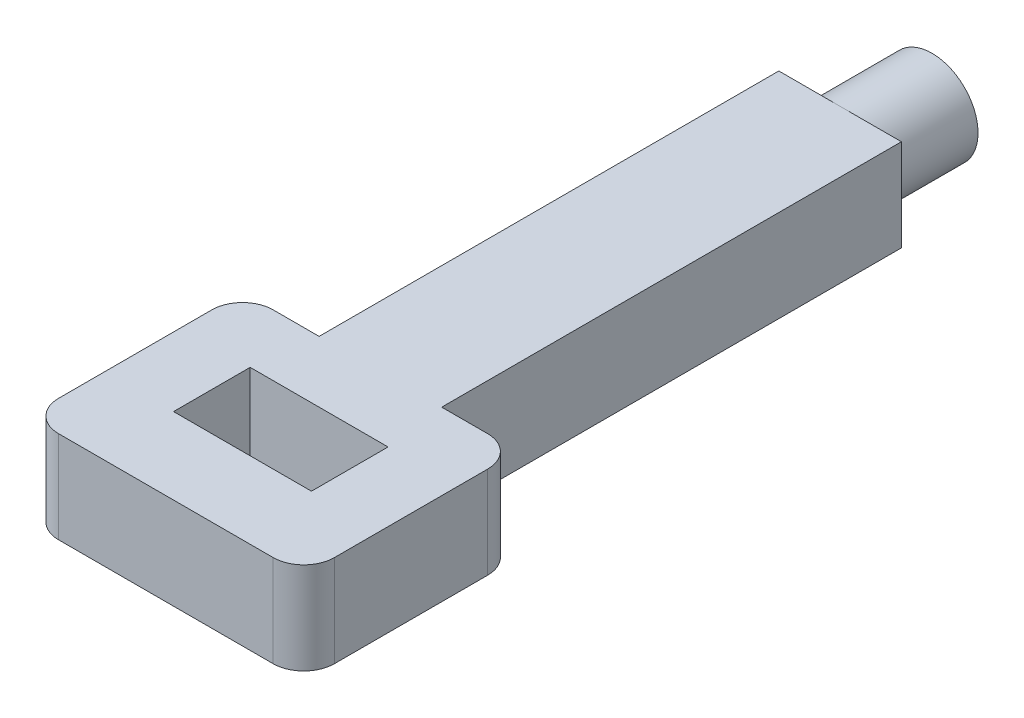
ISO-10303-21;
HEADER;
FILE_DESCRIPTION(('STEP AP214'),'2;1');
FILE_NAME('part.step','',(''),(''),'','','');
FILE_SCHEMA(('AUTOMOTIVE_DESIGN { 1 0 10303 214 1 1 1 1 }'));
ENDSEC;
DATA;
#1=APPLICATION_CONTEXT('core data for automotive mechanical design processes');
#2=APPLICATION_PROTOCOL_DEFINITION('international standard','automotive_design',2000,#1);
#3=PRODUCT_CONTEXT('',#1,'mechanical');
#4=PRODUCT('Part','Part','',(#3));
#5=PRODUCT_RELATED_PRODUCT_CATEGORY('part','',(#4));
#6=PRODUCT_DEFINITION_FORMATION('','',#4);
#7=PRODUCT_DEFINITION_CONTEXT('part definition',#1,'design');
#8=PRODUCT_DEFINITION('design','',#6,#7);
#9=PRODUCT_DEFINITION_SHAPE('','',#8);
#10=(LENGTH_UNIT() NAMED_UNIT(*) SI_UNIT(.MILLI.,.METRE.));
#11=(NAMED_UNIT(*) PLANE_ANGLE_UNIT() SI_UNIT($,.RADIAN.));
#12=(NAMED_UNIT(*) SI_UNIT($,.STERADIAN.) SOLID_ANGLE_UNIT());
#13=UNCERTAINTY_MEASURE_WITH_UNIT(LENGTH_MEASURE(1.E-05),#10,'distance_accuracy_value','');
#14=(GEOMETRIC_REPRESENTATION_CONTEXT(3) GLOBAL_UNCERTAINTY_ASSIGNED_CONTEXT((#13)) GLOBAL_UNIT_ASSIGNED_CONTEXT((#10,
#11,#12)) REPRESENTATION_CONTEXT('',''));
#15=CARTESIAN_POINT('',(0.,0.,0.));
#16=DIRECTION('',(0.,0.,1.));
#17=DIRECTION('',(1.,0.,0.));
#18=AXIS2_PLACEMENT_3D('',#15,#16,#17);
#19=CARTESIAN_POINT('',(-2.,3.,-22.));
#20=DIRECTION('',(0.,0.,1.));
#21=DIRECTION('',(1.,0.,0.));
#22=AXIS2_PLACEMENT_3D('',#19,#20,#21);
#23=PLANE('',#22);
#24=CARTESIAN_POINT('',(0.,1.49999999999648,-22.));
#25=DIRECTION('',(0.,0.,-1.));
#26=DIRECTION('',(-1.,0.,0.));
#27=AXIS2_PLACEMENT_3D('',#24,#25,#26);
#28=CIRCLE('',#27,1.5);
#29=CARTESIAN_POINT('',(0.,2.99999999999648,-22.));
#30=VERTEX_POINT('',#29);
#31=CARTESIAN_POINT('',(0.,0.,-22.));
#32=VERTEX_POINT('',#31);
#33=EDGE_CURVE('E42',#30,#32,#28,.T.);
#34=ORIENTED_EDGE('',*,*,#33,.F.);
#35=DIRECTION('',(-1.,0.,0.));
#36=VECTOR('',#35,1.);
#37=CARTESIAN_POINT('',(-2.,3.,-22.));
#38=LINE('',#37,#36);
#39=CARTESIAN_POINT('',(2.,3.,-22.));
#40=VERTEX_POINT('',#39);
#41=EDGE_CURVE('E153',#40,#30,#38,.T.);
#42=ORIENTED_EDGE('',*,*,#41,.F.);
#43=DIRECTION('',(0.,-1.,0.));
#44=VECTOR('',#43,1.);
#45=CARTESIAN_POINT('',(2.,3.,-22.));
#46=LINE('',#45,#44);
#47=CARTESIAN_POINT('',(2.,0.,-22.));
#48=VERTEX_POINT('',#47);
#49=EDGE_CURVE('E310',#40,#48,#46,.T.);
#50=ORIENTED_EDGE('',*,*,#49,.T.);
#51=DIRECTION('',(-1.,0.,0.));
#52=VECTOR('',#51,1.);
#53=CARTESIAN_POINT('',(-2.,0.,-22.));
#54=LINE('',#53,#52);
#55=EDGE_CURVE('E174',#48,#32,#54,.T.);
#56=ORIENTED_EDGE('',*,*,#55,.T.);
#57=EDGE_LOOP('',(#34,#42,#50,#56));
#58=FACE_BOUND('',#57,.T.);
#59=ADVANCED_FACE('F32',(#58),#23,.F.);
#60=CARTESIAN_POINT('',(0.,3.,0.));
#61=DIRECTION('',(0.,-1.,0.));
#62=DIRECTION('',(0.,0.,-1.));
#63=AXIS2_PLACEMENT_3D('',#60,#61,#62);
#64=PLANE('',#63);
#65=DIRECTION('',(0.,0.,-1.));
#66=VECTOR('',#65,1.);
#67=CARTESIAN_POINT('',(4.5,3.,0.));
#68=LINE('',#67,#66);
#69=CARTESIAN_POINT('',(4.5,3.,-1.));
#70=VERTEX_POINT('',#69);
#71=CARTESIAN_POINT('',(4.5,3.,-6.));
#72=VERTEX_POINT('',#71);
#73=EDGE_CURVE('E275',#70,#72,#68,.T.);
#74=ORIENTED_EDGE('',*,*,#73,.T.);
#75=CARTESIAN_POINT('',(3.5,3.,-6.));
#76=DIRECTION('',(0.,-1.,0.));
#77=DIRECTION('',(0.,0.,-1.));
#78=AXIS2_PLACEMENT_3D('',#75,#76,#77);
#79=CIRCLE('',#78,1.);
#80=CARTESIAN_POINT('',(3.5,3.,-7.));
#81=VERTEX_POINT('',#80);
#82=EDGE_CURVE('E253',#72,#81,#79,.F.);
#83=ORIENTED_EDGE('',*,*,#82,.T.);
#84=DIRECTION('',(-1.,0.,0.));
#85=VECTOR('',#84,1.);
#86=CARTESIAN_POINT('',(4.5,3.,-7.));
#87=LINE('',#86,#85);
#88=CARTESIAN_POINT('',(2.,3.,-7.));
#89=VERTEX_POINT('',#88);
#90=EDGE_CURVE('E278',#81,#89,#87,.T.);
#91=ORIENTED_EDGE('',*,*,#90,.T.);
#92=DIRECTION('',(0.,0.,-1.));
#93=VECTOR('',#92,1.);
#94=CARTESIAN_POINT('',(2.,3.,-7.));
#95=LINE('',#94,#93);
#96=EDGE_CURVE('E160',#89,#40,#95,.T.);
#97=ORIENTED_EDGE('',*,*,#96,.T.);
#98=ORIENTED_EDGE('',*,*,#41,.T.);
#99=CARTESIAN_POINT('',(-2.,3.,-22.));
#100=VERTEX_POINT('',#99);
#101=EDGE_CURVE('E157',#30,#100,#38,.T.);
#102=ORIENTED_EDGE('',*,*,#101,.T.);
#103=DIRECTION('',(0.,0.,1.));
#104=VECTOR('',#103,1.);
#105=CARTESIAN_POINT('',(-2.,3.,-7.));
#106=LINE('',#105,#104);
#107=CARTESIAN_POINT('',(-2.,3.,-7.));
#108=VERTEX_POINT('',#107);
#109=EDGE_CURVE('E165',#100,#108,#106,.T.);
#110=ORIENTED_EDGE('',*,*,#109,.T.);
#111=DIRECTION('',(-1.,0.,0.));
#112=VECTOR('',#111,1.);
#113=CARTESIAN_POINT('',(-4.5,3.,-7.));
#114=LINE('',#113,#112);
#115=CARTESIAN_POINT('',(-3.5,3.,-7.));
#116=VERTEX_POINT('',#115);
#117=EDGE_CURVE('E287',#108,#116,#114,.T.);
#118=ORIENTED_EDGE('',*,*,#117,.T.);
#119=CARTESIAN_POINT('',(-3.5,3.,-6.));
#120=DIRECTION('',(0.,-1.,0.));
#121=DIRECTION('',(0.,0.,-1.));
#122=AXIS2_PLACEMENT_3D('',#119,#120,#121);
#123=CIRCLE('',#122,1.);
#124=CARTESIAN_POINT('',(-4.5,3.,-6.));
#125=VERTEX_POINT('',#124);
#126=EDGE_CURVE('E250',#116,#125,#123,.F.);
#127=ORIENTED_EDGE('',*,*,#126,.T.);
#128=DIRECTION('',(0.,0.,1.));
#129=VECTOR('',#128,1.);
#130=CARTESIAN_POINT('',(-4.5,3.,0.));
#131=LINE('',#130,#129);
#132=CARTESIAN_POINT('',(-4.5,3.,-1.));
#133=VERTEX_POINT('',#132);
#134=EDGE_CURVE('E276',#125,#133,#131,.T.);
#135=ORIENTED_EDGE('',*,*,#134,.T.);
#136=CARTESIAN_POINT('',(-3.5,3.,-1.));
#137=DIRECTION('',(0.,-1.,0.));
#138=DIRECTION('',(0.,0.,-1.));
#139=AXIS2_PLACEMENT_3D('',#136,#137,#138);
#140=CIRCLE('',#139,1.);
#141=CARTESIAN_POINT('',(-3.5,3.,0.));
#142=VERTEX_POINT('',#141);
#143=EDGE_CURVE('E251',#133,#142,#140,.F.);
#144=ORIENTED_EDGE('',*,*,#143,.T.);
#145=DIRECTION('',(1.,0.,0.));
#146=VECTOR('',#145,1.);
#147=CARTESIAN_POINT('',(4.5,3.,0.));
#148=LINE('',#147,#146);
#149=CARTESIAN_POINT('',(3.5,3.,0.));
#150=VERTEX_POINT('',#149);
#151=EDGE_CURVE('E271',#142,#150,#148,.T.);
#152=ORIENTED_EDGE('',*,*,#151,.T.);
#153=CARTESIAN_POINT('',(3.5,3.,-1.));
#154=DIRECTION('',(0.,-1.,0.));
#155=DIRECTION('',(0.,0.,-1.));
#156=AXIS2_PLACEMENT_3D('',#153,#154,#155);
#157=CIRCLE('',#156,1.);
#158=EDGE_CURVE('E245',#150,#70,#157,.F.);
#159=ORIENTED_EDGE('',*,*,#158,.T.);
#160=EDGE_LOOP('',(#74,#83,#91,#97,#98,#102,#110,#118,#127,#135,#144,#152,#159));
#161=FACE_BOUND('',#160,.T.);
#162=DIRECTION('',(0.,0.,-1.));
#163=VECTOR('',#162,1.);
#164=CARTESIAN_POINT('',(2.25,3.,-2.5));
#165=LINE('',#164,#163);
#166=CARTESIAN_POINT('',(2.25,3.,-2.5));
#167=VERTEX_POINT('',#166);
#168=CARTESIAN_POINT('',(2.25,3.,-5.));
#169=VERTEX_POINT('',#168);
#170=EDGE_CURVE('E376',#167,#169,#165,.T.);
#171=ORIENTED_EDGE('',*,*,#170,.F.);
#172=DIRECTION('',(1.,0.,0.));
#173=VECTOR('',#172,1.);
#174=CARTESIAN_POINT('',(-2.25,3.,-2.5));
#175=LINE('',#174,#173);
#176=CARTESIAN_POINT('',(-2.25,3.,-2.5));
#177=VERTEX_POINT('',#176);
#178=EDGE_CURVE('E389',#177,#167,#175,.T.);
#179=ORIENTED_EDGE('',*,*,#178,.F.);
#180=DIRECTION('',(0.,0.,1.));
#181=VECTOR('',#180,1.);
#182=CARTESIAN_POINT('',(-2.25,3.,-2.5));
#183=LINE('',#182,#181);
#184=CARTESIAN_POINT('',(-2.25,3.,-5.));
#185=VERTEX_POINT('',#184);
#186=EDGE_CURVE('E400',#185,#177,#183,.T.);
#187=ORIENTED_EDGE('',*,*,#186,.F.);
#188=DIRECTION('',(-1.,0.,0.));
#189=VECTOR('',#188,1.);
#190=CARTESIAN_POINT('',(-2.25,3.,-5.));
#191=LINE('',#190,#189);
#192=EDGE_CURVE('E402',#169,#185,#191,.T.);
#193=ORIENTED_EDGE('',*,*,#192,.F.);
#194=EDGE_LOOP('',(#171,#179,#187,#193));
#195=FACE_BOUND('',#194,.T.);
#196=ADVANCED_FACE('F155',(#161,#195),#64,.F.);
#197=CARTESIAN_POINT('',(0.,0.,0.));
#198=DIRECTION('',(0.,-1.,0.));
#199=DIRECTION('',(0.,0.,-1.));
#200=AXIS2_PLACEMENT_3D('',#197,#198,#199);
#201=PLANE('',#200);
#202=DIRECTION('',(-1.,0.,0.));
#203=VECTOR('',#202,1.);
#204=CARTESIAN_POINT('',(4.5,0.,-7.));
#205=LINE('',#204,#203);
#206=CARTESIAN_POINT('',(3.5,0.,-7.));
#207=VERTEX_POINT('',#206);
#208=CARTESIAN_POINT('',(2.,0.,-7.));
#209=VERTEX_POINT('',#208);
#210=EDGE_CURVE('E298',#207,#209,#205,.T.);
#211=ORIENTED_EDGE('',*,*,#210,.F.);
#212=CARTESIAN_POINT('',(3.5,0.,-6.));
#213=DIRECTION('',(0.,-1.,0.));
#214=DIRECTION('',(0.,0.,-1.));
#215=AXIS2_PLACEMENT_3D('',#212,#213,#214);
#216=CIRCLE('',#215,1.);
#217=CARTESIAN_POINT('',(4.5,0.,-6.));
#218=VERTEX_POINT('',#217);
#219=EDGE_CURVE('E324',#207,#218,#216,.T.);
#220=ORIENTED_EDGE('',*,*,#219,.T.);
#221=DIRECTION('',(0.,0.,-1.));
#222=VECTOR('',#221,1.);
#223=CARTESIAN_POINT('',(4.5,0.,0.));
#224=LINE('',#223,#222);
#225=CARTESIAN_POINT('',(4.5,0.,-1.));
#226=VERTEX_POINT('',#225);
#227=EDGE_CURVE('E295',#226,#218,#224,.T.);
#228=ORIENTED_EDGE('',*,*,#227,.F.);
#229=CARTESIAN_POINT('',(3.5,0.,-1.));
#230=DIRECTION('',(0.,-1.,0.));
#231=DIRECTION('',(0.,0.,-1.));
#232=AXIS2_PLACEMENT_3D('',#229,#230,#231);
#233=CIRCLE('',#232,1.);
#234=CARTESIAN_POINT('',(3.5,0.,0.));
#235=VERTEX_POINT('',#234);
#236=EDGE_CURVE('E320',#226,#235,#233,.T.);
#237=ORIENTED_EDGE('',*,*,#236,.T.);
#238=DIRECTION('',(1.,0.,0.));
#239=VECTOR('',#238,1.);
#240=CARTESIAN_POINT('',(4.5,0.,0.));
#241=LINE('',#240,#239);
#242=CARTESIAN_POINT('',(-3.5,0.,0.));
#243=VERTEX_POINT('',#242);
#244=EDGE_CURVE('E272',#243,#235,#241,.T.);
#245=ORIENTED_EDGE('',*,*,#244,.F.);
#246=CARTESIAN_POINT('',(-3.5,0.,-1.));
#247=DIRECTION('',(0.,-1.,0.));
#248=DIRECTION('',(0.,0.,-1.));
#249=AXIS2_PLACEMENT_3D('',#246,#247,#248);
#250=CIRCLE('',#249,1.);
#251=CARTESIAN_POINT('',(-4.5,0.,-1.));
#252=VERTEX_POINT('',#251);
#253=EDGE_CURVE('E318',#243,#252,#250,.T.);
#254=ORIENTED_EDGE('',*,*,#253,.T.);
#255=DIRECTION('',(0.,0.,1.));
#256=VECTOR('',#255,1.);
#257=CARTESIAN_POINT('',(-4.5,0.,0.));
#258=LINE('',#257,#256);
#259=CARTESIAN_POINT('',(-4.5,0.,-6.));
#260=VERTEX_POINT('',#259);
#261=EDGE_CURVE('E290',#260,#252,#258,.T.);
#262=ORIENTED_EDGE('',*,*,#261,.F.);
#263=CARTESIAN_POINT('',(-3.5,0.,-6.));
#264=DIRECTION('',(0.,-1.,0.));
#265=DIRECTION('',(0.,0.,-1.));
#266=AXIS2_PLACEMENT_3D('',#263,#264,#265);
#267=CIRCLE('',#266,1.);
#268=CARTESIAN_POINT('',(-3.5,0.,-7.));
#269=VERTEX_POINT('',#268);
#270=EDGE_CURVE('E322',#260,#269,#267,.T.);
#271=ORIENTED_EDGE('',*,*,#270,.T.);
#272=DIRECTION('',(-1.,0.,0.));
#273=VECTOR('',#272,1.);
#274=CARTESIAN_POINT('',(-4.5,0.,-7.));
#275=LINE('',#274,#273);
#276=CARTESIAN_POINT('',(-2.,0.,-7.));
#277=VERTEX_POINT('',#276);
#278=EDGE_CURVE('E280',#277,#269,#275,.T.);
#279=ORIENTED_EDGE('',*,*,#278,.F.);
#280=DIRECTION('',(0.,0.,1.));
#281=VECTOR('',#280,1.);
#282=CARTESIAN_POINT('',(-2.,0.,-7.));
#283=LINE('',#282,#281);
#284=CARTESIAN_POINT('',(-2.,0.,-22.));
#285=VERTEX_POINT('',#284);
#286=EDGE_CURVE('E304',#285,#277,#283,.T.);
#287=ORIENTED_EDGE('',*,*,#286,.F.);
#288=EDGE_CURVE('E302',#32,#285,#54,.T.);
#289=ORIENTED_EDGE('',*,*,#288,.F.);
#290=ORIENTED_EDGE('',*,*,#55,.F.);
#291=DIRECTION('',(0.,0.,-1.));
#292=VECTOR('',#291,1.);
#293=CARTESIAN_POINT('',(2.,0.,-7.));
#294=LINE('',#293,#292);
#295=EDGE_CURVE('E300',#209,#48,#294,.T.);
#296=ORIENTED_EDGE('',*,*,#295,.F.);
#297=EDGE_LOOP('',(#211,#220,#228,#237,#245,#254,#262,#271,#279,#287,#289,#290,#296));
#298=FACE_BOUND('',#297,.T.);
#299=DIRECTION('',(1.,0.,0.));
#300=VECTOR('',#299,1.);
#301=CARTESIAN_POINT('',(-2.25,0.,-2.5));
#302=LINE('',#301,#300);
#303=CARTESIAN_POINT('',(-2.25,0.,-2.5));
#304=VERTEX_POINT('',#303);
#305=CARTESIAN_POINT('',(2.25,0.,-2.5));
#306=VERTEX_POINT('',#305);
#307=EDGE_CURVE('E369',#304,#306,#302,.T.);
#308=ORIENTED_EDGE('',*,*,#307,.T.);
#309=DIRECTION('',(0.,0.,-1.));
#310=VECTOR('',#309,1.);
#311=CARTESIAN_POINT('',(2.25,0.,-2.5));
#312=LINE('',#311,#310);
#313=CARTESIAN_POINT('',(2.25,0.,-5.));
#314=VERTEX_POINT('',#313);
#315=EDGE_CURVE('E384',#306,#314,#312,.T.);
#316=ORIENTED_EDGE('',*,*,#315,.T.);
#317=DIRECTION('',(-1.,0.,0.));
#318=VECTOR('',#317,1.);
#319=CARTESIAN_POINT('',(-2.25,0.,-5.));
#320=LINE('',#319,#318);
#321=CARTESIAN_POINT('',(-2.25,0.,-5.));
#322=VERTEX_POINT('',#321);
#323=EDGE_CURVE('E381',#314,#322,#320,.T.);
#324=ORIENTED_EDGE('',*,*,#323,.T.);
#325=DIRECTION('',(0.,0.,1.));
#326=VECTOR('',#325,1.);
#327=CARTESIAN_POINT('',(-2.25,0.,-2.5));
#328=LINE('',#327,#326);
#329=EDGE_CURVE('E377',#322,#304,#328,.T.);
#330=ORIENTED_EDGE('',*,*,#329,.T.);
#331=EDGE_LOOP('',(#308,#316,#324,#330));
#332=FACE_BOUND('',#331,.T.);
#333=ADVANCED_FACE('F197',(#298,#332),#201,.T.);
#334=CARTESIAN_POINT('',(-4.5,3.,0.));
#335=DIRECTION('',(1.,0.,0.));
#336=DIRECTION('',(0.,0.,-1.));
#337=AXIS2_PLACEMENT_3D('',#334,#335,#336);
#338=PLANE('',#337);
#339=ORIENTED_EDGE('',*,*,#134,.F.);
#340=DIRECTION('',(0.,-1.,0.));
#341=VECTOR('',#340,1.);
#342=CARTESIAN_POINT('',(-4.5,3.,-6.));
#343=LINE('',#342,#341);
#344=EDGE_CURVE('E262',#125,#260,#343,.T.);
#345=ORIENTED_EDGE('',*,*,#344,.T.);
#346=ORIENTED_EDGE('',*,*,#261,.T.);
#347=DIRECTION('',(0.,-1.,0.));
#348=VECTOR('',#347,1.);
#349=CARTESIAN_POINT('',(-4.5,3.,-1.));
#350=LINE('',#349,#348);
#351=EDGE_CURVE('E260',#252,#133,#350,.F.);
#352=ORIENTED_EDGE('',*,*,#351,.T.);
#353=EDGE_LOOP('',(#339,#345,#346,#352));
#354=FACE_BOUND('',#353,.T.);
#355=ADVANCED_FACE('F225',(#354),#338,.F.);
#356=CARTESIAN_POINT('',(4.5,3.,0.));
#357=DIRECTION('',(0.,0.,-1.));
#358=DIRECTION('',(-1.,0.,0.));
#359=AXIS2_PLACEMENT_3D('',#356,#357,#358);
#360=PLANE('',#359);
#361=ORIENTED_EDGE('',*,*,#244,.T.);
#362=DIRECTION('',(0.,-1.,0.));
#363=VECTOR('',#362,1.);
#364=CARTESIAN_POINT('',(3.5,3.,0.));
#365=LINE('',#364,#363);
#366=EDGE_CURVE('E36',#235,#150,#365,.F.);
#367=ORIENTED_EDGE('',*,*,#366,.T.);
#368=ORIENTED_EDGE('',*,*,#151,.F.);
#369=DIRECTION('',(0.,-1.,0.));
#370=VECTOR('',#369,1.);
#371=CARTESIAN_POINT('',(-3.5,3.,0.));
#372=LINE('',#371,#370);
#373=EDGE_CURVE('E265',#142,#243,#372,.T.);
#374=ORIENTED_EDGE('',*,*,#373,.T.);
#375=EDGE_LOOP('',(#361,#367,#368,#374));
#376=FACE_BOUND('',#375,.T.);
#377=ADVANCED_FACE('F221',(#376),#360,.F.);
#378=CARTESIAN_POINT('',(4.5,3.,0.));
#379=DIRECTION('',(-1.,0.,0.));
#380=DIRECTION('',(0.,0.,1.));
#381=AXIS2_PLACEMENT_3D('',#378,#379,#380);
#382=PLANE('',#381);
#383=ORIENTED_EDGE('',*,*,#227,.T.);
#384=DIRECTION('',(0.,-1.,0.));
#385=VECTOR('',#384,1.);
#386=CARTESIAN_POINT('',(4.5,3.,-6.));
#387=LINE('',#386,#385);
#388=EDGE_CURVE('E255',#218,#72,#387,.F.);
#389=ORIENTED_EDGE('',*,*,#388,.T.);
#390=ORIENTED_EDGE('',*,*,#73,.F.);
#391=DIRECTION('',(0.,-1.,0.));
#392=VECTOR('',#391,1.);
#393=CARTESIAN_POINT('',(4.5,3.,-1.));
#394=LINE('',#393,#392);
#395=EDGE_CURVE('E247',#70,#226,#394,.T.);
#396=ORIENTED_EDGE('',*,*,#395,.T.);
#397=EDGE_LOOP('',(#383,#389,#390,#396));
#398=FACE_BOUND('',#397,.T.);
#399=ADVANCED_FACE('F215',(#398),#382,.F.);
#400=CARTESIAN_POINT('',(4.5,3.,-7.));
#401=DIRECTION('',(0.,0.,1.));
#402=DIRECTION('',(1.,0.,0.));
#403=AXIS2_PLACEMENT_3D('',#400,#401,#402);
#404=PLANE('',#403);
#405=ORIENTED_EDGE('',*,*,#90,.F.);
#406=DIRECTION('',(0.,-1.,0.));
#407=VECTOR('',#406,1.);
#408=CARTESIAN_POINT('',(3.5,3.,-7.));
#409=LINE('',#408,#407);
#410=EDGE_CURVE('E315',#81,#207,#409,.T.);
#411=ORIENTED_EDGE('',*,*,#410,.T.);
#412=ORIENTED_EDGE('',*,*,#210,.T.);
#413=DIRECTION('',(0.,-1.,0.));
#414=VECTOR('',#413,1.);
#415=CARTESIAN_POINT('',(2.,3.,-7.));
#416=LINE('',#415,#414);
#417=EDGE_CURVE('E312',#89,#209,#416,.T.);
#418=ORIENTED_EDGE('',*,*,#417,.F.);
#419=EDGE_LOOP('',(#405,#411,#412,#418));
#420=FACE_BOUND('',#419,.T.);
#421=ADVANCED_FACE('F210',(#420),#404,.F.);
#422=CARTESIAN_POINT('',(2.,3.,-7.));
#423=DIRECTION('',(-1.,0.,0.));
#424=DIRECTION('',(0.,0.,1.));
#425=AXIS2_PLACEMENT_3D('',#422,#423,#424);
#426=PLANE('',#425);
#427=ORIENTED_EDGE('',*,*,#295,.T.);
#428=ORIENTED_EDGE('',*,*,#49,.F.);
#429=ORIENTED_EDGE('',*,*,#96,.F.);
#430=ORIENTED_EDGE('',*,*,#417,.T.);
#431=EDGE_LOOP('',(#427,#428,#429,#430));
#432=FACE_BOUND('',#431,.T.);
#433=ADVANCED_FACE('F203',(#432),#426,.F.);
#434=EDGE_CURVE('E11',#32,#30,#28,.T.);
#435=ORIENTED_EDGE('',*,*,#434,.F.);
#436=ORIENTED_EDGE('',*,*,#288,.T.);
#437=DIRECTION('',(0.,-1.,0.));
#438=VECTOR('',#437,1.);
#439=CARTESIAN_POINT('',(-2.,3.,-22.));
#440=LINE('',#439,#438);
#441=EDGE_CURVE('E169',#100,#285,#440,.T.);
#442=ORIENTED_EDGE('',*,*,#441,.F.);
#443=ORIENTED_EDGE('',*,*,#101,.F.);
#444=EDGE_LOOP('',(#435,#436,#442,#443));
#445=FACE_BOUND('',#444,.T.);
#446=ADVANCED_FACE('F167',(#445),#23,.F.);
#447=CARTESIAN_POINT('',(-2.,3.,-7.));
#448=DIRECTION('',(1.,0.,0.));
#449=DIRECTION('',(0.,0.,-1.));
#450=AXIS2_PLACEMENT_3D('',#447,#448,#449);
#451=PLANE('',#450);
#452=ORIENTED_EDGE('',*,*,#286,.T.);
#453=DIRECTION('',(0.,-1.,0.));
#454=VECTOR('',#453,1.);
#455=CARTESIAN_POINT('',(-2.,3.,-7.));
#456=LINE('',#455,#454);
#457=EDGE_CURVE('E289',#108,#277,#456,.T.);
#458=ORIENTED_EDGE('',*,*,#457,.F.);
#459=ORIENTED_EDGE('',*,*,#109,.F.);
#460=ORIENTED_EDGE('',*,*,#441,.T.);
#461=EDGE_LOOP('',(#452,#458,#459,#460));
#462=FACE_BOUND('',#461,.T.);
#463=ADVANCED_FACE('F202',(#462),#451,.F.);
#464=CARTESIAN_POINT('',(-4.5,3.,-7.));
#465=DIRECTION('',(0.,0.,1.));
#466=DIRECTION('',(1.,0.,0.));
#467=AXIS2_PLACEMENT_3D('',#464,#465,#466);
#468=PLANE('',#467);
#469=ORIENTED_EDGE('',*,*,#278,.T.);
#470=DIRECTION('',(0.,-1.,0.));
#471=VECTOR('',#470,1.);
#472=CARTESIAN_POINT('',(-3.5,3.,-7.));
#473=LINE('',#472,#471);
#474=EDGE_CURVE('E55',#269,#116,#473,.F.);
#475=ORIENTED_EDGE('',*,*,#474,.T.);
#476=ORIENTED_EDGE('',*,*,#117,.F.);
#477=ORIENTED_EDGE('',*,*,#457,.T.);
#478=EDGE_LOOP('',(#469,#475,#476,#477));
#479=FACE_BOUND('',#478,.T.);
#480=ADVANCED_FACE('F208',(#479),#468,.F.);
#481=CARTESIAN_POINT('',(2.25,3.,-2.5));
#482=DIRECTION('',(-1.,0.,0.));
#483=DIRECTION('',(0.,0.,1.));
#484=AXIS2_PLACEMENT_3D('',#481,#482,#483);
#485=PLANE('',#484);
#486=ORIENTED_EDGE('',*,*,#315,.F.);
#487=DIRECTION('',(0.,-1.,0.));
#488=VECTOR('',#487,1.);
#489=CARTESIAN_POINT('',(2.25,3.,-2.5));
#490=LINE('',#489,#488);
#491=EDGE_CURVE('E374',#167,#306,#490,.T.);
#492=ORIENTED_EDGE('',*,*,#491,.F.);
#493=ORIENTED_EDGE('',*,*,#170,.T.);
#494=DIRECTION('',(0.,-1.,0.));
#495=VECTOR('',#494,1.);
#496=CARTESIAN_POINT('',(2.25,3.,-5.));
#497=LINE('',#496,#495);
#498=EDGE_CURVE('E293',#169,#314,#497,.T.);
#499=ORIENTED_EDGE('',*,*,#498,.T.);
#500=EDGE_LOOP('',(#486,#492,#493,#499));
#501=FACE_BOUND('',#500,.T.);
#502=ADVANCED_FACE('F345',(#501),#485,.T.);
#503=CARTESIAN_POINT('',(-2.25,3.,-5.));
#504=DIRECTION('',(0.,0.,1.));
#505=DIRECTION('',(1.,0.,0.));
#506=AXIS2_PLACEMENT_3D('',#503,#504,#505);
#507=PLANE('',#506);
#508=ORIENTED_EDGE('',*,*,#323,.F.);
#509=ORIENTED_EDGE('',*,*,#498,.F.);
#510=ORIENTED_EDGE('',*,*,#192,.T.);
#511=DIRECTION('',(0.,-1.,0.));
#512=VECTOR('',#511,1.);
#513=CARTESIAN_POINT('',(-2.25,3.,-5.));
#514=LINE('',#513,#512);
#515=EDGE_CURVE('E391',#185,#322,#514,.T.);
#516=ORIENTED_EDGE('',*,*,#515,.T.);
#517=EDGE_LOOP('',(#508,#509,#510,#516));
#518=FACE_BOUND('',#517,.T.);
#519=ADVANCED_FACE('F350',(#518),#507,.T.);
#520=CARTESIAN_POINT('',(-2.25,3.,-2.5));
#521=DIRECTION('',(1.,0.,0.));
#522=DIRECTION('',(0.,0.,-1.));
#523=AXIS2_PLACEMENT_3D('',#520,#521,#522);
#524=PLANE('',#523);
#525=ORIENTED_EDGE('',*,*,#329,.F.);
#526=ORIENTED_EDGE('',*,*,#515,.F.);
#527=ORIENTED_EDGE('',*,*,#186,.T.);
#528=DIRECTION('',(0.,-1.,0.));
#529=VECTOR('',#528,1.);
#530=CARTESIAN_POINT('',(-2.25,3.,-2.5));
#531=LINE('',#530,#529);
#532=EDGE_CURVE('E371',#177,#304,#531,.T.);
#533=ORIENTED_EDGE('',*,*,#532,.T.);
#534=EDGE_LOOP('',(#525,#526,#527,#533));
#535=FACE_BOUND('',#534,.T.);
#536=ADVANCED_FACE('F358',(#535),#524,.T.);
#537=CARTESIAN_POINT('',(-2.25,3.,-2.5));
#538=DIRECTION('',(0.,0.,-1.));
#539=DIRECTION('',(-1.,0.,0.));
#540=AXIS2_PLACEMENT_3D('',#537,#538,#539);
#541=PLANE('',#540);
#542=ORIENTED_EDGE('',*,*,#307,.F.);
#543=ORIENTED_EDGE('',*,*,#532,.F.);
#544=ORIENTED_EDGE('',*,*,#178,.T.);
#545=ORIENTED_EDGE('',*,*,#491,.T.);
#546=EDGE_LOOP('',(#542,#543,#544,#545));
#547=FACE_BOUND('',#546,.T.);
#548=ADVANCED_FACE('F234',(#547),#541,.T.);
#549=CARTESIAN_POINT('',(3.5,3.,-6.));
#550=DIRECTION('',(0.,-1.,0.));
#551=DIRECTION('',(0.,0.,-1.));
#552=AXIS2_PLACEMENT_3D('',#549,#550,#551);
#553=CYLINDRICAL_SURFACE('',#552,1.);
#554=ORIENTED_EDGE('',*,*,#82,.F.);
#555=ORIENTED_EDGE('',*,*,#388,.F.);
#556=ORIENTED_EDGE('',*,*,#219,.F.);
#557=ORIENTED_EDGE('',*,*,#410,.F.);
#558=EDGE_LOOP('',(#554,#555,#556,#557));
#559=FACE_BOUND('',#558,.T.);
#560=ADVANCED_FACE('F230',(#559),#553,.T.);
#561=CARTESIAN_POINT('',(-3.5,3.,-6.));
#562=DIRECTION('',(0.,-1.,0.));
#563=DIRECTION('',(0.,0.,-1.));
#564=AXIS2_PLACEMENT_3D('',#561,#562,#563);
#565=CYLINDRICAL_SURFACE('',#564,1.);
#566=ORIENTED_EDGE('',*,*,#126,.F.);
#567=ORIENTED_EDGE('',*,*,#474,.F.);
#568=ORIENTED_EDGE('',*,*,#270,.F.);
#569=ORIENTED_EDGE('',*,*,#344,.F.);
#570=EDGE_LOOP('',(#566,#567,#568,#569));
#571=FACE_BOUND('',#570,.T.);
#572=ADVANCED_FACE('F233',(#571),#565,.T.);
#573=CARTESIAN_POINT('',(3.5,3.,-1.));
#574=DIRECTION('',(0.,-1.,0.));
#575=DIRECTION('',(0.,0.,-1.));
#576=AXIS2_PLACEMENT_3D('',#573,#574,#575);
#577=CYLINDRICAL_SURFACE('',#576,1.);
#578=ORIENTED_EDGE('',*,*,#158,.F.);
#579=ORIENTED_EDGE('',*,*,#366,.F.);
#580=ORIENTED_EDGE('',*,*,#236,.F.);
#581=ORIENTED_EDGE('',*,*,#395,.F.);
#582=EDGE_LOOP('',(#578,#579,#580,#581));
#583=FACE_BOUND('',#582,.T.);
#584=ADVANCED_FACE('F188',(#583),#577,.T.);
#585=CARTESIAN_POINT('',(-3.5,3.,-1.));
#586=DIRECTION('',(0.,-1.,0.));
#587=DIRECTION('',(0.,0.,-1.));
#588=AXIS2_PLACEMENT_3D('',#585,#586,#587);
#589=CYLINDRICAL_SURFACE('',#588,1.);
#590=ORIENTED_EDGE('',*,*,#143,.F.);
#591=ORIENTED_EDGE('',*,*,#351,.F.);
#592=ORIENTED_EDGE('',*,*,#253,.F.);
#593=ORIENTED_EDGE('',*,*,#373,.F.);
#594=EDGE_LOOP('',(#590,#591,#592,#593));
#595=FACE_BOUND('',#594,.T.);
#596=ADVANCED_FACE('F34',(#595),#589,.T.);
#597=CARTESIAN_POINT('',(0.,1.49999999999648,-25.));
#598=DIRECTION('',(0.,0.,1.));
#599=DIRECTION('',(1.,0.,0.));
#600=AXIS2_PLACEMENT_3D('',#597,#598,#599);
#601=CYLINDRICAL_SURFACE('',#600,1.5);
#602=CARTESIAN_POINT('',(0.,1.49999999999648,-25.));
#603=DIRECTION('',(0.,0.,-1.));
#604=DIRECTION('',(-1.,0.,0.));
#605=AXIS2_PLACEMENT_3D('',#602,#603,#604);
#606=CIRCLE('',#605,1.5);
#607=CARTESIAN_POINT('',(-1.5,1.49999999999648,-25.));
#608=VERTEX_POINT('',#607);
#609=EDGE_CURVE('E176',#608,#608,#606,.T.);
#610=ORIENTED_EDGE('',*,*,#609,.F.);
#611=EDGE_LOOP('',(#610));
#612=FACE_BOUND('',#611,.T.);
#613=ORIENTED_EDGE('',*,*,#33,.T.);
#614=ORIENTED_EDGE('',*,*,#434,.T.);
#615=EDGE_LOOP('',(#613,#614));
#616=FACE_BOUND('',#615,.T.);
#617=ADVANCED_FACE('F177',(#612,#616),#601,.T.);
#618=CARTESIAN_POINT('',(0.,1.49999999999648,-25.));
#619=DIRECTION('',(0.,0.,-1.));
#620=DIRECTION('',(-1.,0.,0.));
#621=AXIS2_PLACEMENT_3D('',#618,#619,#620);
#622=PLANE('',#621);
#623=ORIENTED_EDGE('',*,*,#609,.T.);
#624=EDGE_LOOP('',(#623));
#625=FACE_BOUND('',#624,.T.);
#626=ADVANCED_FACE('F179',(#625),#622,.T.);
#627=CLOSED_SHELL('',(#59,#196,#333,#355,#377,#399,#421,#433,#446,#463,#480,#502,#519,#536,#548,
#560,#572,#584,#596,#617,#626));
#628=MANIFOLD_SOLID_BREP('B2',#627);
#629=ADVANCED_BREP_SHAPE_REPRESENTATION('',(#18,#628),#14);
#630=SHAPE_DEFINITION_REPRESENTATION(#9,#629);
ENDSEC;
END-ISO-10303-21;
